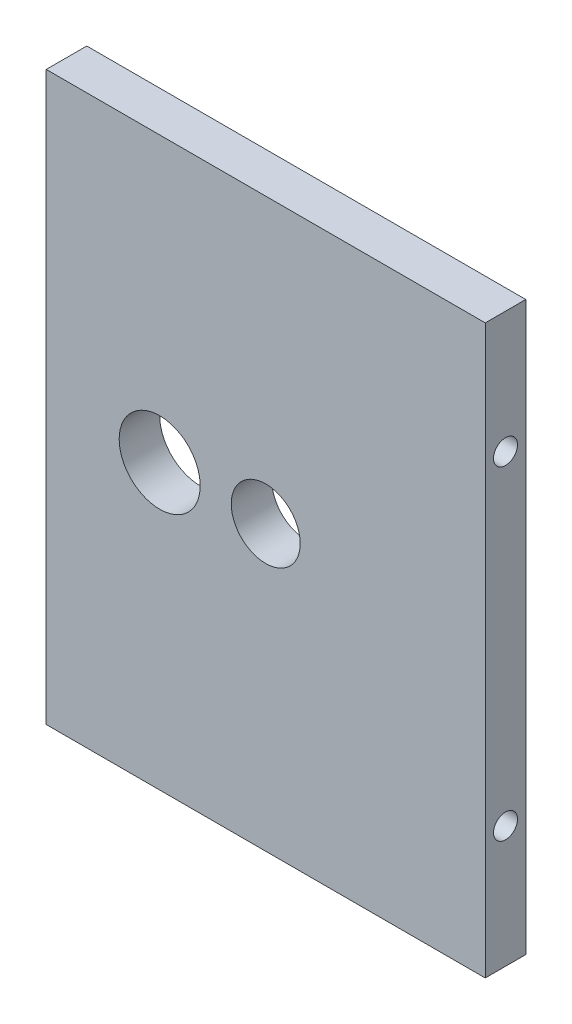
ISO-10303-21;
HEADER;
FILE_DESCRIPTION(('STEP AP214'),'2;1');
FILE_NAME('part.step','',(''),(''),'','','');
FILE_SCHEMA(('AUTOMOTIVE_DESIGN { 1 0 10303 214 1 1 1 1 }'));
ENDSEC;
DATA;
#1=APPLICATION_CONTEXT('core data for automotive mechanical design processes');
#2=APPLICATION_PROTOCOL_DEFINITION('international standard','automotive_design',2000,#1);
#3=PRODUCT_CONTEXT('',#1,'mechanical');
#4=PRODUCT('Part','Part','',(#3));
#5=PRODUCT_RELATED_PRODUCT_CATEGORY('part','',(#4));
#6=PRODUCT_DEFINITION_FORMATION('','',#4);
#7=PRODUCT_DEFINITION_CONTEXT('part definition',#1,'design');
#8=PRODUCT_DEFINITION('design','',#6,#7);
#9=PRODUCT_DEFINITION_SHAPE('','',#8);
#10=(LENGTH_UNIT() NAMED_UNIT(*) SI_UNIT(.MILLI.,.METRE.));
#11=(NAMED_UNIT(*) PLANE_ANGLE_UNIT() SI_UNIT($,.RADIAN.));
#12=(NAMED_UNIT(*) SI_UNIT($,.STERADIAN.) SOLID_ANGLE_UNIT());
#13=UNCERTAINTY_MEASURE_WITH_UNIT(LENGTH_MEASURE(1.E-05),#10,'distance_accuracy_value','');
#14=(GEOMETRIC_REPRESENTATION_CONTEXT(3) GLOBAL_UNCERTAINTY_ASSIGNED_CONTEXT((#13)) GLOBAL_UNIT_ASSIGNED_CONTEXT((#10,
#11,#12)) REPRESENTATION_CONTEXT('',''));
#15=CARTESIAN_POINT('',(0.,0.,0.));
#16=DIRECTION('',(0.,0.,1.));
#17=DIRECTION('',(1.,0.,0.));
#18=AXIS2_PLACEMENT_3D('',#15,#16,#17);
#19=CARTESIAN_POINT('',(0.,0.,3.));
#20=DIRECTION('',(1.,0.,0.));
#21=DIRECTION('',(0.,0.,-1.));
#22=AXIS2_PLACEMENT_3D('',#19,#20,#21);
#23=PLANE('',#22);
#24=CARTESIAN_POINT('',(0.,33.,1.5));
#25=DIRECTION('',(-1.,0.,0.));
#26=DIRECTION('',(0.,0.,1.));
#27=AXIS2_PLACEMENT_3D('',#24,#25,#26);
#28=CIRCLE('',#27,0.889000000000001);
#29=CARTESIAN_POINT('',(0.,33.,2.389));
#30=VERTEX_POINT('',#29);
#31=EDGE_CURVE('E132',#30,#30,#28,.T.);
#32=ORIENTED_EDGE('',*,*,#31,.F.);
#33=EDGE_LOOP('',(#32));
#34=FACE_BOUND('',#33,.T.);
#35=CARTESIAN_POINT('',(0.,9.,1.5));
#36=DIRECTION('',(-1.,0.,0.));
#37=DIRECTION('',(0.,0.,1.));
#38=AXIS2_PLACEMENT_3D('',#35,#36,#37);
#39=CIRCLE('',#38,0.888999999999999);
#40=CARTESIAN_POINT('',(0.,9.,2.389));
#41=VERTEX_POINT('',#40);
#42=EDGE_CURVE('E140',#41,#41,#39,.T.);
#43=ORIENTED_EDGE('',*,*,#42,.F.);
#44=EDGE_LOOP('',(#43));
#45=FACE_BOUND('',#44,.T.);
#46=DIRECTION('',(0.,-1.,0.));
#47=VECTOR('',#46,1.);
#48=CARTESIAN_POINT('',(0.,0.,0.));
#49=LINE('',#48,#47);
#50=CARTESIAN_POINT('',(0.,42.,0.));
#51=VERTEX_POINT('',#50);
#52=CARTESIAN_POINT('',(0.,0.,0.));
#53=VERTEX_POINT('',#52);
#54=EDGE_CURVE('E148',#51,#53,#49,.T.);
#55=ORIENTED_EDGE('',*,*,#54,.T.);
#56=DIRECTION('',(0.,0.,-1.));
#57=VECTOR('',#56,1.);
#58=CARTESIAN_POINT('',(0.,0.,3.));
#59=LINE('',#58,#57);
#60=CARTESIAN_POINT('',(0.,0.,3.));
#61=VERTEX_POINT('',#60);
#62=EDGE_CURVE('E11',#61,#53,#59,.T.);
#63=ORIENTED_EDGE('',*,*,#62,.F.);
#64=DIRECTION('',(0.,-1.,0.));
#65=VECTOR('',#64,1.);
#66=CARTESIAN_POINT('',(0.,0.,3.));
#67=LINE('',#66,#65);
#68=CARTESIAN_POINT('',(0.,42.,3.));
#69=VERTEX_POINT('',#68);
#70=EDGE_CURVE('E149',#69,#61,#67,.T.);
#71=ORIENTED_EDGE('',*,*,#70,.F.);
#72=DIRECTION('',(0.,0.,-1.));
#73=VECTOR('',#72,1.);
#74=CARTESIAN_POINT('',(0.,42.,3.));
#75=LINE('',#74,#73);
#76=EDGE_CURVE('E159',#69,#51,#75,.T.);
#77=ORIENTED_EDGE('',*,*,#76,.T.);
#78=EDGE_LOOP('',(#55,#63,#71,#77));
#79=FACE_BOUND('',#78,.T.);
#80=ADVANCED_FACE('F44',(#34,#45,#79),#23,.F.);
#81=CARTESIAN_POINT('',(0.,0.,3.));
#82=DIRECTION('',(0.,1.,0.));
#83=DIRECTION('',(0.,0.,1.));
#84=AXIS2_PLACEMENT_3D('',#81,#82,#83);
#85=PLANE('',#84);
#86=DIRECTION('',(1.,0.,0.));
#87=VECTOR('',#86,1.);
#88=CARTESIAN_POINT('',(0.,0.,0.));
#89=LINE('',#88,#87);
#90=CARTESIAN_POINT('',(32.5,0.,0.));
#91=VERTEX_POINT('',#90);
#92=EDGE_CURVE('E163',#53,#91,#89,.T.);
#93=ORIENTED_EDGE('',*,*,#92,.T.);
#94=DIRECTION('',(0.,0.,-1.));
#95=VECTOR('',#94,1.);
#96=CARTESIAN_POINT('',(32.5,0.,3.));
#97=LINE('',#96,#95);
#98=CARTESIAN_POINT('',(32.5,0.,3.));
#99=VERTEX_POINT('',#98);
#100=EDGE_CURVE('E53',#99,#91,#97,.T.);
#101=ORIENTED_EDGE('',*,*,#100,.F.);
#102=DIRECTION('',(1.,0.,0.));
#103=VECTOR('',#102,1.);
#104=CARTESIAN_POINT('',(0.,0.,3.));
#105=LINE('',#104,#103);
#106=EDGE_CURVE('E92',#61,#99,#105,.T.);
#107=ORIENTED_EDGE('',*,*,#106,.F.);
#108=ORIENTED_EDGE('',*,*,#62,.T.);
#109=EDGE_LOOP('',(#93,#101,#107,#108));
#110=FACE_BOUND('',#109,.T.);
#111=ADVANCED_FACE('F193',(#110),#85,.F.);
#112=CARTESIAN_POINT('',(32.5,0.,3.));
#113=DIRECTION('',(-1.,0.,0.));
#114=DIRECTION('',(0.,0.,1.));
#115=AXIS2_PLACEMENT_3D('',#112,#113,#114);
#116=PLANE('',#115);
#117=CARTESIAN_POINT('',(32.5,33.,1.5));
#118=DIRECTION('',(1.,0.,0.));
#119=DIRECTION('',(0.,0.,-1.));
#120=AXIS2_PLACEMENT_3D('',#117,#118,#119);
#121=CIRCLE('',#120,0.888999999999987);
#122=CARTESIAN_POINT('',(32.5,33.,0.611000000000013));
#123=VERTEX_POINT('',#122);
#124=EDGE_CURVE('E117',#123,#123,#121,.T.);
#125=ORIENTED_EDGE('',*,*,#124,.F.);
#126=EDGE_LOOP('',(#125));
#127=FACE_BOUND('',#126,.T.);
#128=CARTESIAN_POINT('',(32.5,9.,1.5));
#129=DIRECTION('',(1.,0.,0.));
#130=DIRECTION('',(0.,0.,-1.));
#131=AXIS2_PLACEMENT_3D('',#128,#129,#130);
#132=CIRCLE('',#131,0.888999999999989);
#133=CARTESIAN_POINT('',(32.5,9.,0.611000000000012));
#134=VERTEX_POINT('',#133);
#135=EDGE_CURVE('E116',#134,#134,#132,.T.);
#136=ORIENTED_EDGE('',*,*,#135,.F.);
#137=EDGE_LOOP('',(#136));
#138=FACE_BOUND('',#137,.T.);
#139=DIRECTION('',(0.,1.,0.));
#140=VECTOR('',#139,1.);
#141=CARTESIAN_POINT('',(32.5,0.,0.));
#142=LINE('',#141,#140);
#143=CARTESIAN_POINT('',(32.5,42.,0.));
#144=VERTEX_POINT('',#143);
#145=EDGE_CURVE('E79',#91,#144,#142,.T.);
#146=ORIENTED_EDGE('',*,*,#145,.T.);
#147=DIRECTION('',(0.,0.,-1.));
#148=VECTOR('',#147,1.);
#149=CARTESIAN_POINT('',(32.5,42.,3.));
#150=LINE('',#149,#148);
#151=CARTESIAN_POINT('',(32.5,42.,3.));
#152=VERTEX_POINT('',#151);
#153=EDGE_CURVE('E172',#152,#144,#150,.T.);
#154=ORIENTED_EDGE('',*,*,#153,.F.);
#155=DIRECTION('',(0.,1.,0.));
#156=VECTOR('',#155,1.);
#157=CARTESIAN_POINT('',(32.5,0.,3.));
#158=LINE('',#157,#156);
#159=EDGE_CURVE('E154',#99,#152,#158,.T.);
#160=ORIENTED_EDGE('',*,*,#159,.F.);
#161=ORIENTED_EDGE('',*,*,#100,.T.);
#162=EDGE_LOOP('',(#146,#154,#160,#161));
#163=FACE_BOUND('',#162,.T.);
#164=ADVANCED_FACE('F176',(#127,#138,#163),#116,.F.);
#165=CARTESIAN_POINT('',(0.,42.,3.));
#166=DIRECTION('',(0.,-1.,0.));
#167=DIRECTION('',(0.,0.,-1.));
#168=AXIS2_PLACEMENT_3D('',#165,#166,#167);
#169=PLANE('',#168);
#170=DIRECTION('',(-1.,0.,0.));
#171=VECTOR('',#170,1.);
#172=CARTESIAN_POINT('',(0.,42.,0.));
#173=LINE('',#172,#171);
#174=EDGE_CURVE('E85',#144,#51,#173,.T.);
#175=ORIENTED_EDGE('',*,*,#174,.T.);
#176=ORIENTED_EDGE('',*,*,#76,.F.);
#177=DIRECTION('',(-1.,0.,0.));
#178=VECTOR('',#177,1.);
#179=CARTESIAN_POINT('',(0.,42.,3.));
#180=LINE('',#179,#178);
#181=EDGE_CURVE('E61',#152,#69,#180,.T.);
#182=ORIENTED_EDGE('',*,*,#181,.F.);
#183=ORIENTED_EDGE('',*,*,#153,.T.);
#184=EDGE_LOOP('',(#175,#176,#182,#183));
#185=FACE_BOUND('',#184,.T.);
#186=ADVANCED_FACE('F183',(#185),#169,.F.);
#187=CARTESIAN_POINT('',(0.,0.,3.));
#188=DIRECTION('',(0.,0.,-1.));
#189=DIRECTION('',(-1.,0.,0.));
#190=AXIS2_PLACEMENT_3D('',#187,#188,#189);
#191=PLANE('',#190);
#192=CARTESIAN_POINT('',(16.25,21.,3.));
#193=DIRECTION('',(0.,0.,-1.));
#194=DIRECTION('',(-1.,0.,0.));
#195=AXIS2_PLACEMENT_3D('',#192,#193,#194);
#196=CIRCLE('',#195,2.5527);
#197=CARTESIAN_POINT('',(13.6973,21.,3.));
#198=VERTEX_POINT('',#197);
#199=EDGE_CURVE('E236',#198,#198,#196,.T.);
#200=ORIENTED_EDGE('',*,*,#199,.T.);
#201=EDGE_LOOP('',(#200));
#202=FACE_BOUND('',#201,.T.);
#203=CARTESIAN_POINT('',(8.4,21.,3.));
#204=DIRECTION('',(0.,0.,-1.));
#205=DIRECTION('',(-1.,0.,0.));
#206=AXIS2_PLACEMENT_3D('',#203,#204,#205);
#207=CIRCLE('',#206,3.);
#208=CARTESIAN_POINT('',(5.4,21.,3.));
#209=VERTEX_POINT('',#208);
#210=EDGE_CURVE('E125',#209,#209,#207,.T.);
#211=ORIENTED_EDGE('',*,*,#210,.T.);
#212=EDGE_LOOP('',(#211));
#213=FACE_BOUND('',#212,.T.);
#214=ORIENTED_EDGE('',*,*,#70,.T.);
#215=ORIENTED_EDGE('',*,*,#106,.T.);
#216=ORIENTED_EDGE('',*,*,#159,.T.);
#217=ORIENTED_EDGE('',*,*,#181,.T.);
#218=EDGE_LOOP('',(#214,#215,#216,#217));
#219=FACE_BOUND('',#218,.T.);
#220=ADVANCED_FACE('F185',(#202,#213,#219),#191,.F.);
#221=CARTESIAN_POINT('',(0.,0.,0.));
#222=DIRECTION('',(0.,0.,-1.));
#223=DIRECTION('',(-1.,0.,0.));
#224=AXIS2_PLACEMENT_3D('',#221,#222,#223);
#225=PLANE('',#224);
#226=CARTESIAN_POINT('',(16.25,21.,0.));
#227=DIRECTION('',(0.,0.,-1.));
#228=DIRECTION('',(-1.,0.,0.));
#229=AXIS2_PLACEMENT_3D('',#226,#227,#228);
#230=CIRCLE('',#229,2.55269999999999);
#231=CARTESIAN_POINT('',(13.6973,21.,0.));
#232=VERTEX_POINT('',#231);
#233=EDGE_CURVE('E230',#232,#232,#230,.T.);
#234=ORIENTED_EDGE('',*,*,#233,.F.);
#235=EDGE_LOOP('',(#234));
#236=FACE_BOUND('',#235,.T.);
#237=CARTESIAN_POINT('',(8.4,21.,0.));
#238=DIRECTION('',(0.,0.,-1.));
#239=DIRECTION('',(-1.,0.,0.));
#240=AXIS2_PLACEMENT_3D('',#237,#238,#239);
#241=CIRCLE('',#240,3.);
#242=CARTESIAN_POINT('',(5.4,21.,0.));
#243=VERTEX_POINT('',#242);
#244=EDGE_CURVE('E233',#243,#243,#241,.T.);
#245=ORIENTED_EDGE('',*,*,#244,.F.);
#246=EDGE_LOOP('',(#245));
#247=FACE_BOUND('',#246,.T.);
#248=ORIENTED_EDGE('',*,*,#54,.F.);
#249=ORIENTED_EDGE('',*,*,#174,.F.);
#250=ORIENTED_EDGE('',*,*,#145,.F.);
#251=ORIENTED_EDGE('',*,*,#92,.F.);
#252=EDGE_LOOP('',(#248,#249,#250,#251));
#253=FACE_BOUND('',#252,.T.);
#254=ADVANCED_FACE('F179',(#236,#247,#253),#225,.T.);
#255=CARTESIAN_POINT('',(5.1958349096845,9.,1.5));
#256=DIRECTION('',(-1.,0.,0.));
#257=DIRECTION('',(0.,0.,1.));
#258=AXIS2_PLACEMENT_3D('',#255,#256,#257);
#259=CONICAL_SURFACE('',#258,0.888999999999997,1.02974425867665);
#260=CARTESIAN_POINT('',(5.73,9.,1.5));
#261=VERTEX_POINT('',#260);
#262=VERTEX_LOOP('',#261);
#263=FACE_BOUND('',#262,.T.);
#264=CARTESIAN_POINT('',(5.1958349096845,9.,1.5));
#265=DIRECTION('',(-1.,0.,0.));
#266=DIRECTION('',(0.,0.,1.));
#267=AXIS2_PLACEMENT_3D('',#264,#265,#266);
#268=CIRCLE('',#267,0.888999999999997);
#269=CARTESIAN_POINT('',(5.1958349096845,9.,2.389));
#270=VERTEX_POINT('',#269);
#271=EDGE_CURVE('E144',#270,#270,#268,.T.);
#272=ORIENTED_EDGE('',*,*,#271,.T.);
#273=EDGE_LOOP('',(#272));
#274=FACE_BOUND('',#273,.T.);
#275=ADVANCED_FACE('F209',(#263,#274),#259,.F.);
#276=CARTESIAN_POINT('',(0.,9.,1.5));
#277=DIRECTION('',(-1.,0.,0.));
#278=DIRECTION('',(0.,0.,1.));
#279=AXIS2_PLACEMENT_3D('',#276,#277,#278);
#280=CYLINDRICAL_SURFACE('',#279,0.888999999999998);
#281=ORIENTED_EDGE('',*,*,#271,.F.);
#282=EDGE_LOOP('',(#281));
#283=FACE_BOUND('',#282,.T.);
#284=ORIENTED_EDGE('',*,*,#42,.T.);
#285=EDGE_LOOP('',(#284));
#286=FACE_BOUND('',#285,.T.);
#287=ADVANCED_FACE('F206',(#283,#286),#280,.F.);
#288=CARTESIAN_POINT('',(5.1958349096845,33.,1.5));
#289=DIRECTION('',(-1.,0.,0.));
#290=DIRECTION('',(0.,0.,1.));
#291=AXIS2_PLACEMENT_3D('',#288,#289,#290);
#292=CONICAL_SURFACE('',#291,0.889000000000001,1.02974425867665);
#293=CARTESIAN_POINT('',(5.73,33.,1.5));
#294=VERTEX_POINT('',#293);
#295=VERTEX_LOOP('',#294);
#296=FACE_BOUND('',#295,.T.);
#297=CARTESIAN_POINT('',(5.1958349096845,33.,1.5));
#298=DIRECTION('',(-1.,0.,0.));
#299=DIRECTION('',(0.,0.,1.));
#300=AXIS2_PLACEMENT_3D('',#297,#298,#299);
#301=CIRCLE('',#300,0.889000000000001);
#302=CARTESIAN_POINT('',(5.1958349096845,33.,2.389));
#303=VERTEX_POINT('',#302);
#304=EDGE_CURVE('E136',#303,#303,#301,.T.);
#305=ORIENTED_EDGE('',*,*,#304,.T.);
#306=EDGE_LOOP('',(#305));
#307=FACE_BOUND('',#306,.T.);
#308=ADVANCED_FACE('F208',(#296,#307),#292,.F.);
#309=CARTESIAN_POINT('',(0.,33.,1.5));
#310=DIRECTION('',(-1.,0.,0.));
#311=DIRECTION('',(0.,0.,1.));
#312=AXIS2_PLACEMENT_3D('',#309,#310,#311);
#313=CYLINDRICAL_SURFACE('',#312,0.889000000000001);
#314=ORIENTED_EDGE('',*,*,#304,.F.);
#315=EDGE_LOOP('',(#314));
#316=FACE_BOUND('',#315,.T.);
#317=ORIENTED_EDGE('',*,*,#31,.T.);
#318=EDGE_LOOP('',(#317));
#319=FACE_BOUND('',#318,.T.);
#320=ADVANCED_FACE('F216',(#316,#319),#313,.F.);
#321=CARTESIAN_POINT('',(27.3041650903155,9.,1.5));
#322=DIRECTION('',(1.,0.,0.));
#323=DIRECTION('',(0.,0.,-1.));
#324=AXIS2_PLACEMENT_3D('',#321,#322,#323);
#325=CONICAL_SURFACE('',#324,0.888999999999999,1.02974425867665);
#326=CARTESIAN_POINT('',(26.77,9.,1.5));
#327=VERTEX_POINT('',#326);
#328=VERTEX_LOOP('',#327);
#329=FACE_BOUND('',#328,.T.);
#330=CARTESIAN_POINT('',(27.3041650903155,9.,1.5));
#331=DIRECTION('',(1.,0.,0.));
#332=DIRECTION('',(0.,0.,-1.));
#333=AXIS2_PLACEMENT_3D('',#330,#331,#332);
#334=CIRCLE('',#333,0.888999999999999);
#335=CARTESIAN_POINT('',(27.3041650903155,9.,0.611000000000001));
#336=VERTEX_POINT('',#335);
#337=EDGE_CURVE('E122',#336,#336,#334,.T.);
#338=ORIENTED_EDGE('',*,*,#337,.T.);
#339=EDGE_LOOP('',(#338));
#340=FACE_BOUND('',#339,.T.);
#341=ADVANCED_FACE('F262',(#329,#340),#325,.F.);
#342=CARTESIAN_POINT('',(32.5,9.,1.5));
#343=DIRECTION('',(1.,0.,0.));
#344=DIRECTION('',(0.,0.,-1.));
#345=AXIS2_PLACEMENT_3D('',#342,#343,#344);
#346=CYLINDRICAL_SURFACE('',#345,0.888999999999994);
#347=ORIENTED_EDGE('',*,*,#337,.F.);
#348=EDGE_LOOP('',(#347));
#349=FACE_BOUND('',#348,.T.);
#350=ORIENTED_EDGE('',*,*,#135,.T.);
#351=EDGE_LOOP('',(#350));
#352=FACE_BOUND('',#351,.T.);
#353=ADVANCED_FACE('F109',(#349,#352),#346,.F.);
#354=CARTESIAN_POINT('',(27.3041650903155,33.,1.5));
#355=DIRECTION('',(1.,0.,0.));
#356=DIRECTION('',(0.,0.,-1.));
#357=AXIS2_PLACEMENT_3D('',#354,#355,#356);
#358=CONICAL_SURFACE('',#357,0.889000000000001,1.02974425867665);
#359=CARTESIAN_POINT('',(26.77,33.,1.5));
#360=VERTEX_POINT('',#359);
#361=VERTEX_LOOP('',#360);
#362=FACE_BOUND('',#361,.T.);
#363=CARTESIAN_POINT('',(27.3041650903155,33.,1.5));
#364=DIRECTION('',(1.,0.,0.));
#365=DIRECTION('',(0.,0.,-1.));
#366=AXIS2_PLACEMENT_3D('',#363,#364,#365);
#367=CIRCLE('',#366,0.889000000000001);
#368=CARTESIAN_POINT('',(27.3041650903155,33.,0.610999999999999));
#369=VERTEX_POINT('',#368);
#370=EDGE_CURVE('E113',#369,#369,#367,.T.);
#371=ORIENTED_EDGE('',*,*,#370,.T.);
#372=EDGE_LOOP('',(#371));
#373=FACE_BOUND('',#372,.T.);
#374=ADVANCED_FACE('F105',(#362,#373),#358,.F.);
#375=CARTESIAN_POINT('',(32.5,33.,1.5));
#376=DIRECTION('',(1.,0.,0.));
#377=DIRECTION('',(0.,0.,-1.));
#378=AXIS2_PLACEMENT_3D('',#375,#376,#377);
#379=CYLINDRICAL_SURFACE('',#378,0.888999999999994);
#380=ORIENTED_EDGE('',*,*,#370,.F.);
#381=EDGE_LOOP('',(#380));
#382=FACE_BOUND('',#381,.T.);
#383=ORIENTED_EDGE('',*,*,#124,.T.);
#384=EDGE_LOOP('',(#383));
#385=FACE_BOUND('',#384,.T.);
#386=ADVANCED_FACE('F108',(#382,#385),#379,.F.);
#387=CARTESIAN_POINT('',(8.4,21.,3.));
#388=DIRECTION('',(0.,0.,-1.));
#389=DIRECTION('',(-1.,0.,0.));
#390=AXIS2_PLACEMENT_3D('',#387,#388,#389);
#391=CYLINDRICAL_SURFACE('',#390,3.);
#392=ORIENTED_EDGE('',*,*,#210,.F.);
#393=EDGE_LOOP('',(#392));
#394=FACE_BOUND('',#393,.T.);
#395=ORIENTED_EDGE('',*,*,#244,.T.);
#396=EDGE_LOOP('',(#395));
#397=FACE_BOUND('',#396,.T.);
#398=ADVANCED_FACE('F248',(#394,#397),#391,.F.);
#399=CARTESIAN_POINT('',(16.25,21.,0.));
#400=DIRECTION('',(0.,0.,-1.));
#401=DIRECTION('',(-1.,0.,0.));
#402=AXIS2_PLACEMENT_3D('',#399,#400,#401);
#403=CYLINDRICAL_SURFACE('',#402,2.55269999999999);
#404=ORIENTED_EDGE('',*,*,#199,.F.);
#405=EDGE_LOOP('',(#404));
#406=FACE_BOUND('',#405,.T.);
#407=ORIENTED_EDGE('',*,*,#233,.T.);
#408=EDGE_LOOP('',(#407));
#409=FACE_BOUND('',#408,.T.);
#410=ADVANCED_FACE('F246',(#406,#409),#403,.F.);
#411=CLOSED_SHELL('',(#80,#111,#164,#186,#220,#254,#275,#287,#308,#320,#341,#353,#374,#386,#398,#410));
#412=MANIFOLD_SOLID_BREP('B2',#411);
#413=ADVANCED_BREP_SHAPE_REPRESENTATION('',(#18,#412),#14);
#414=SHAPE_DEFINITION_REPRESENTATION(#9,#413);
ENDSEC;
END-ISO-10303-21;
